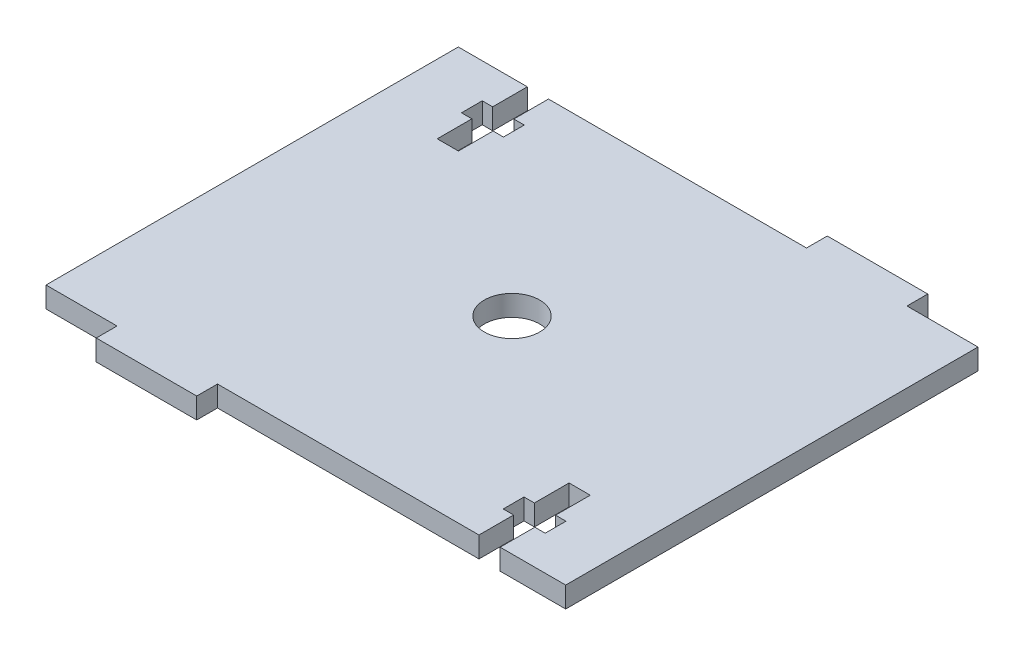
ISO-10303-21;
HEADER;
FILE_DESCRIPTION(('STEP AP214'),'2;1');
FILE_NAME('part.step','',(''),(''),'','','');
FILE_SCHEMA(('AUTOMOTIVE_DESIGN { 1 0 10303 214 1 1 1 1 }'));
ENDSEC;
DATA;
#1=APPLICATION_CONTEXT('core data for automotive mechanical design processes');
#2=APPLICATION_PROTOCOL_DEFINITION('international standard','automotive_design',2000,#1);
#3=PRODUCT_CONTEXT('',#1,'mechanical');
#4=PRODUCT('Part','Part','',(#3));
#5=PRODUCT_RELATED_PRODUCT_CATEGORY('part','',(#4));
#6=PRODUCT_DEFINITION_FORMATION('','',#4);
#7=PRODUCT_DEFINITION_CONTEXT('part definition',#1,'design');
#8=PRODUCT_DEFINITION('design','',#6,#7);
#9=PRODUCT_DEFINITION_SHAPE('','',#8);
#10=(LENGTH_UNIT() NAMED_UNIT(*) SI_UNIT(.MILLI.,.METRE.));
#11=(NAMED_UNIT(*) PLANE_ANGLE_UNIT() SI_UNIT($,.RADIAN.));
#12=(NAMED_UNIT(*) SI_UNIT($,.STERADIAN.) SOLID_ANGLE_UNIT());
#13=UNCERTAINTY_MEASURE_WITH_UNIT(LENGTH_MEASURE(1.E-05),#10,'distance_accuracy_value','');
#14=(GEOMETRIC_REPRESENTATION_CONTEXT(3) GLOBAL_UNCERTAINTY_ASSIGNED_CONTEXT((#13)) GLOBAL_UNIT_ASSIGNED_CONTEXT((#10,
#11,#12)) REPRESENTATION_CONTEXT('',''));
#15=CARTESIAN_POINT('',(0.,0.,0.));
#16=DIRECTION('',(0.,0.,1.));
#17=DIRECTION('',(1.,0.,0.));
#18=AXIS2_PLACEMENT_3D('',#15,#16,#17);
#19=CARTESIAN_POINT('',(24.7500000000028,3.,1.71737624121723E-13));
#20=DIRECTION('',(1.,0.,0.));
#21=DIRECTION('',(0.,0.,-1.));
#22=AXIS2_PLACEMENT_3D('',#19,#20,#21);
#23=PLANE('',#22);
#24=DIRECTION('',(0.,0.,1.));
#25=VECTOR('',#24,1.);
#26=CARTESIAN_POINT('',(24.7500000000028,0.,1.71737624121723E-13));
#27=LINE('',#26,#25);
#28=CARTESIAN_POINT('',(24.7500000000028,0.,0.));
#29=VERTEX_POINT('',#28);
#30=CARTESIAN_POINT('',(24.7500000000028,0.,3.00000000000063));
#31=VERTEX_POINT('',#30);
#32=EDGE_CURVE('E301',#29,#31,#27,.T.);
#33=ORIENTED_EDGE('',*,*,#32,.F.);
#34=DIRECTION('',(0.,-1.,0.));
#35=VECTOR('',#34,1.);
#36=CARTESIAN_POINT('',(24.7500000000028,3.,0.));
#37=LINE('',#36,#35);
#38=CARTESIAN_POINT('',(24.7500000000028,3.,0.));
#39=VERTEX_POINT('',#38);
#40=EDGE_CURVE('E11',#39,#29,#37,.T.);
#41=ORIENTED_EDGE('',*,*,#40,.F.);
#42=DIRECTION('',(0.,0.,1.));
#43=VECTOR('',#42,1.);
#44=CARTESIAN_POINT('',(24.7500000000028,3.,1.71737624121723E-13));
#45=LINE('',#44,#43);
#46=CARTESIAN_POINT('',(24.7500000000028,3.,3.00000000000063));
#47=VERTEX_POINT('',#46);
#48=EDGE_CURVE('E400',#39,#47,#45,.T.);
#49=ORIENTED_EDGE('',*,*,#48,.T.);
#50=DIRECTION('',(0.,-1.,0.));
#51=VECTOR('',#50,1.);
#52=CARTESIAN_POINT('',(24.7500000000028,3.,3.00000000000063));
#53=LINE('',#52,#51);
#54=EDGE_CURVE('E48',#47,#31,#53,.T.);
#55=ORIENTED_EDGE('',*,*,#54,.T.);
#56=EDGE_LOOP('',(#33,#41,#49,#55));
#57=FACE_BOUND('',#56,.T.);
#58=ADVANCED_FACE('F32',(#57),#23,.T.);
#59=CARTESIAN_POINT('',(0.,3.,0.));
#60=DIRECTION('',(0.,0.,-1.));
#61=DIRECTION('',(-1.,0.,0.));
#62=AXIS2_PLACEMENT_3D('',#59,#60,#61);
#63=PLANE('',#62);
#64=DIRECTION('',(1.,0.,0.));
#65=VECTOR('',#64,1.);
#66=CARTESIAN_POINT('',(0.,0.,0.));
#67=LINE('',#66,#65);
#68=CARTESIAN_POINT('',(62.4840512444006,0.,0.));
#69=VERTEX_POINT('',#68);
#70=EDGE_CURVE('E303',#29,#69,#67,.T.);
#71=ORIENTED_EDGE('',*,*,#70,.T.);
#72=DIRECTION('',(0.,-1.,0.));
#73=VECTOR('',#72,1.);
#74=CARTESIAN_POINT('',(62.4840512444006,3.,0.));
#75=LINE('',#74,#73);
#76=CARTESIAN_POINT('',(62.4840512444006,3.,0.));
#77=VERTEX_POINT('',#76);
#78=EDGE_CURVE('E40',#77,#69,#75,.T.);
#79=ORIENTED_EDGE('',*,*,#78,.F.);
#80=DIRECTION('',(1.,0.,0.));
#81=VECTOR('',#80,1.);
#82=CARTESIAN_POINT('',(0.,3.,0.));
#83=LINE('',#82,#81);
#84=EDGE_CURVE('E281',#39,#77,#83,.T.);
#85=ORIENTED_EDGE('',*,*,#84,.F.);
#86=ORIENTED_EDGE('',*,*,#40,.T.);
#87=EDGE_LOOP('',(#71,#79,#85,#86));
#88=FACE_BOUND('',#87,.T.);
#89=ADVANCED_FACE('F474',(#88),#63,.F.);
#90=CARTESIAN_POINT('',(62.4840512444005,3.,4.33570202271198E-13));
#91=DIRECTION('',(1.,0.,0.));
#92=DIRECTION('',(0.,0.,-1.));
#93=AXIS2_PLACEMENT_3D('',#90,#91,#92);
#94=PLANE('',#93);
#95=DIRECTION('',(0.,0.,1.));
#96=VECTOR('',#95,1.);
#97=CARTESIAN_POINT('',(62.4840512444005,0.,4.33570202271198E-13));
#98=LINE('',#97,#96);
#99=CARTESIAN_POINT('',(62.4840512444006,0.,-5.00000000000209));
#100=VERTEX_POINT('',#99);
#101=EDGE_CURVE('E306',#100,#69,#98,.T.);
#102=ORIENTED_EDGE('',*,*,#101,.F.);
#103=DIRECTION('',(0.,-1.,0.));
#104=VECTOR('',#103,1.);
#105=CARTESIAN_POINT('',(62.4840512444006,3.,-5.00000000000209));
#106=LINE('',#105,#104);
#107=CARTESIAN_POINT('',(62.4840512444006,3.,-5.00000000000209));
#108=VERTEX_POINT('',#107);
#109=EDGE_CURVE('E464',#108,#100,#106,.T.);
#110=ORIENTED_EDGE('',*,*,#109,.F.);
#111=DIRECTION('',(0.,0.,1.));
#112=VECTOR('',#111,1.);
#113=CARTESIAN_POINT('',(62.4840512444005,3.,4.33570202271198E-13));
#114=LINE('',#113,#112);
#115=EDGE_CURVE('E471',#108,#77,#114,.T.);
#116=ORIENTED_EDGE('',*,*,#115,.T.);
#117=ORIENTED_EDGE('',*,*,#78,.T.);
#118=EDGE_LOOP('',(#102,#110,#116,#117));
#119=FACE_BOUND('',#118,.T.);
#120=ADVANCED_FACE('F469',(#119),#94,.T.);
#121=CARTESIAN_POINT('',(0.,3.,-5.00000000000237));
#122=DIRECTION('',(0.,0.,-1.));
#123=DIRECTION('',(-1.,0.,0.));
#124=AXIS2_PLACEMENT_3D('',#121,#122,#123);
#125=PLANE('',#124);
#126=DIRECTION('',(1.,0.,0.));
#127=VECTOR('',#126,1.);
#128=CARTESIAN_POINT('',(0.,0.,-5.00000000000237));
#129=LINE('',#128,#127);
#130=CARTESIAN_POINT('',(60.9840512444006,0.,-5.00000000000209));
#131=VERTEX_POINT('',#130);
#132=EDGE_CURVE('E310',#131,#100,#129,.T.);
#133=ORIENTED_EDGE('',*,*,#132,.F.);
#134=DIRECTION('',(0.,-1.,0.));
#135=VECTOR('',#134,1.);
#136=CARTESIAN_POINT('',(60.9840512444006,3.,-5.00000000000209));
#137=LINE('',#136,#135);
#138=CARTESIAN_POINT('',(60.9840512444006,3.,-5.00000000000209));
#139=VERTEX_POINT('',#138);
#140=EDGE_CURVE('E462',#139,#131,#137,.T.);
#141=ORIENTED_EDGE('',*,*,#140,.F.);
#142=DIRECTION('',(1.,0.,0.));
#143=VECTOR('',#142,1.);
#144=CARTESIAN_POINT('',(0.,3.,-5.00000000000237));
#145=LINE('',#144,#143);
#146=EDGE_CURVE('E484',#139,#108,#145,.T.);
#147=ORIENTED_EDGE('',*,*,#146,.T.);
#148=ORIENTED_EDGE('',*,*,#109,.T.);
#149=EDGE_LOOP('',(#133,#141,#147,#148));
#150=FACE_BOUND('',#149,.T.);
#151=ADVANCED_FACE('F481',(#150),#125,.T.);
#152=CARTESIAN_POINT('',(60.9840512444006,3.,2.82107907610224E-13));
#153=DIRECTION('',(1.,0.,0.));
#154=DIRECTION('',(0.,0.,-1.));
#155=AXIS2_PLACEMENT_3D('',#152,#153,#154);
#156=PLANE('',#155);
#157=DIRECTION('',(0.,0.,1.));
#158=VECTOR('',#157,1.);
#159=CARTESIAN_POINT('',(60.9840512444006,0.,2.82107907610224E-13));
#160=LINE('',#159,#158);
#161=CARTESIAN_POINT('',(60.9840512444006,0.,-8.0000000000021));
#162=VERTEX_POINT('',#161);
#163=EDGE_CURVE('E313',#162,#131,#160,.T.);
#164=ORIENTED_EDGE('',*,*,#163,.F.);
#165=DIRECTION('',(0.,-1.,0.));
#166=VECTOR('',#165,1.);
#167=CARTESIAN_POINT('',(60.9840512444006,3.,-8.0000000000021));
#168=LINE('',#167,#166);
#169=CARTESIAN_POINT('',(60.9840512444006,3.,-8.0000000000021));
#170=VERTEX_POINT('',#169);
#171=EDGE_CURVE('E460',#170,#162,#168,.T.);
#172=ORIENTED_EDGE('',*,*,#171,.F.);
#173=DIRECTION('',(0.,0.,1.));
#174=VECTOR('',#173,1.);
#175=CARTESIAN_POINT('',(60.9840512444006,3.,2.82107907610224E-13));
#176=LINE('',#175,#174);
#177=EDGE_CURVE('E488',#170,#139,#176,.T.);
#178=ORIENTED_EDGE('',*,*,#177,.T.);
#179=ORIENTED_EDGE('',*,*,#140,.T.);
#180=EDGE_LOOP('',(#164,#172,#178,#179));
#181=FACE_BOUND('',#180,.T.);
#182=ADVANCED_FACE('F670',(#181),#156,.T.);
#183=CARTESIAN_POINT('',(0.,3.,-8.00000000000267));
#184=DIRECTION('',(0.,0.,1.));
#185=DIRECTION('',(1.,0.,0.));
#186=AXIS2_PLACEMENT_3D('',#183,#184,#185);
#187=PLANE('',#186);
#188=DIRECTION('',(-1.,0.,0.));
#189=VECTOR('',#188,1.);
#190=CARTESIAN_POINT('',(0.,0.,-8.00000000000267));
#191=LINE('',#190,#189);
#192=CARTESIAN_POINT('',(62.4840512444006,0.,-8.00000000000209));
#193=VERTEX_POINT('',#192);
#194=EDGE_CURVE('E316',#193,#162,#191,.T.);
#195=ORIENTED_EDGE('',*,*,#194,.F.);
#196=DIRECTION('',(0.,-1.,0.));
#197=VECTOR('',#196,1.);
#198=CARTESIAN_POINT('',(62.4840512444006,3.,-8.00000000000209));
#199=LINE('',#198,#197);
#200=CARTESIAN_POINT('',(62.4840512444006,3.,-8.00000000000209));
#201=VERTEX_POINT('',#200);
#202=EDGE_CURVE('E458',#201,#193,#199,.T.);
#203=ORIENTED_EDGE('',*,*,#202,.F.);
#204=DIRECTION('',(-1.,0.,0.));
#205=VECTOR('',#204,1.);
#206=CARTESIAN_POINT('',(0.,3.,-8.00000000000267));
#207=LINE('',#206,#205);
#208=EDGE_CURVE('E493',#201,#170,#207,.T.);
#209=ORIENTED_EDGE('',*,*,#208,.T.);
#210=ORIENTED_EDGE('',*,*,#171,.T.);
#211=EDGE_LOOP('',(#195,#203,#209,#210));
#212=FACE_BOUND('',#211,.T.);
#213=ADVANCED_FACE('F668',(#212),#187,.T.);
#214=CARTESIAN_POINT('',(62.4840512444005,3.,4.33570202271198E-13));
#215=DIRECTION('',(1.,0.,0.));
#216=DIRECTION('',(0.,0.,-1.));
#217=AXIS2_PLACEMENT_3D('',#214,#215,#216);
#218=PLANE('',#217);
#219=DIRECTION('',(0.,0.,1.));
#220=VECTOR('',#219,1.);
#221=CARTESIAN_POINT('',(62.4840512444005,0.,4.33570202271198E-13));
#222=LINE('',#221,#220);
#223=CARTESIAN_POINT('',(62.4840512444006,0.,-13.0000000000021));
#224=VERTEX_POINT('',#223);
#225=EDGE_CURVE('E319',#224,#193,#222,.T.);
#226=ORIENTED_EDGE('',*,*,#225,.F.);
#227=DIRECTION('',(0.,-1.,0.));
#228=VECTOR('',#227,1.);
#229=CARTESIAN_POINT('',(62.4840512444006,3.,-13.0000000000021));
#230=LINE('',#229,#228);
#231=CARTESIAN_POINT('',(62.4840512444006,3.,-13.0000000000021));
#232=VERTEX_POINT('',#231);
#233=EDGE_CURVE('E456',#232,#224,#230,.T.);
#234=ORIENTED_EDGE('',*,*,#233,.F.);
#235=DIRECTION('',(0.,0.,1.));
#236=VECTOR('',#235,1.);
#237=CARTESIAN_POINT('',(62.4840512444005,3.,4.33570202271198E-13));
#238=LINE('',#237,#236);
#239=EDGE_CURVE('E496',#232,#201,#238,.T.);
#240=ORIENTED_EDGE('',*,*,#239,.T.);
#241=ORIENTED_EDGE('',*,*,#202,.T.);
#242=EDGE_LOOP('',(#226,#234,#240,#241));
#243=FACE_BOUND('',#242,.T.);
#244=ADVANCED_FACE('F664',(#243),#218,.T.);
#245=CARTESIAN_POINT('',(9.38196026013298E-12,3.,-13.0000000000472));
#246=DIRECTION('',(-7.21689250776841E-13,0.,1.));
#247=DIRECTION('',(1.,0.,7.21689250776841E-13));
#248=AXIS2_PLACEMENT_3D('',#245,#246,#247);
#249=PLANE('',#248);
#250=DIRECTION('',(-1.,0.,-7.21689250776841E-13));
#251=VECTOR('',#250,1.);
#252=CARTESIAN_POINT('',(9.38196026013298E-12,0.,-13.0000000000472));
#253=LINE('',#252,#251);
#254=CARTESIAN_POINT('',(65.5415559239664,0.,-12.9999999999999));
#255=VERTEX_POINT('',#254);
#256=EDGE_CURVE('E322',#255,#224,#253,.T.);
#257=ORIENTED_EDGE('',*,*,#256,.F.);
#258=DIRECTION('',(0.,-1.,0.));
#259=VECTOR('',#258,1.);
#260=CARTESIAN_POINT('',(65.5415559239664,3.,-12.9999999999999));
#261=LINE('',#260,#259);
#262=CARTESIAN_POINT('',(65.5415559239664,3.,-12.9999999999999));
#263=VERTEX_POINT('',#262);
#264=EDGE_CURVE('E454',#263,#255,#261,.T.);
#265=ORIENTED_EDGE('',*,*,#264,.F.);
#266=DIRECTION('',(-1.,0.,-7.21689250776841E-13));
#267=VECTOR('',#266,1.);
#268=CARTESIAN_POINT('',(9.38196026013298E-12,3.,-13.0000000000472));
#269=LINE('',#268,#267);
#270=EDGE_CURVE('E499',#263,#232,#269,.T.);
#271=ORIENTED_EDGE('',*,*,#270,.T.);
#272=ORIENTED_EDGE('',*,*,#233,.T.);
#273=EDGE_LOOP('',(#257,#265,#271,#272));
#274=FACE_BOUND('',#273,.T.);
#275=ADVANCED_FACE('F660',(#274),#249,.T.);
#276=CARTESIAN_POINT('',(65.5415559239651,3.,6.36700263995033E-12));
#277=DIRECTION('',(-1.,0.,0.));
#278=DIRECTION('',(0.,0.,1.));
#279=AXIS2_PLACEMENT_3D('',#276,#277,#278);
#280=PLANE('',#279);
#281=DIRECTION('',(0.,0.,-1.));
#282=VECTOR('',#281,1.);
#283=CARTESIAN_POINT('',(65.5415559239651,0.,6.36700263995033E-12));
#284=LINE('',#283,#282);
#285=CARTESIAN_POINT('',(65.5415559239659,0.,-8.00000000000207));
#286=VERTEX_POINT('',#285);
#287=EDGE_CURVE('E325',#286,#255,#284,.T.);
#288=ORIENTED_EDGE('',*,*,#287,.F.);
#289=DIRECTION('',(0.,-1.,0.));
#290=VECTOR('',#289,1.);
#291=CARTESIAN_POINT('',(65.5415559239659,3.,-8.00000000000207));
#292=LINE('',#291,#290);
#293=CARTESIAN_POINT('',(65.5415559239659,3.,-8.00000000000207));
#294=VERTEX_POINT('',#293);
#295=EDGE_CURVE('E452',#294,#286,#292,.T.);
#296=ORIENTED_EDGE('',*,*,#295,.F.);
#297=DIRECTION('',(0.,0.,-1.));
#298=VECTOR('',#297,1.);
#299=CARTESIAN_POINT('',(65.5415559239651,3.,6.36700263995033E-12));
#300=LINE('',#299,#298);
#301=EDGE_CURVE('E502',#294,#263,#300,.T.);
#302=ORIENTED_EDGE('',*,*,#301,.T.);
#303=ORIENTED_EDGE('',*,*,#264,.T.);
#304=EDGE_LOOP('',(#288,#296,#302,#303));
#305=FACE_BOUND('',#304,.T.);
#306=ADVANCED_FACE('F656',(#305),#280,.T.);
#307=CARTESIAN_POINT('',(1.19904086660998E-11,3.,-8.0000000001003));
#308=DIRECTION('',(-1.49880108324368E-12,0.,1.));
#309=DIRECTION('',(1.,0.,1.49880108324368E-12));
#310=AXIS2_PLACEMENT_3D('',#307,#308,#309);
#311=PLANE('',#310);
#312=DIRECTION('',(-1.,0.,-1.49880108324368E-12));
#313=VECTOR('',#312,1.);
#314=CARTESIAN_POINT('',(1.19904086660998E-11,0.,-8.0000000001003));
#315=LINE('',#314,#313);
#316=CARTESIAN_POINT('',(67.0415559239662,0.,-7.99999999999982));
#317=VERTEX_POINT('',#316);
#318=EDGE_CURVE('E328',#317,#286,#315,.T.);
#319=ORIENTED_EDGE('',*,*,#318,.F.);
#320=DIRECTION('',(0.,-1.,0.));
#321=VECTOR('',#320,1.);
#322=CARTESIAN_POINT('',(67.0415559239662,3.,-7.99999999999982));
#323=LINE('',#322,#321);
#324=CARTESIAN_POINT('',(67.0415559239662,3.,-7.99999999999982));
#325=VERTEX_POINT('',#324);
#326=EDGE_CURVE('E450',#325,#317,#323,.T.);
#327=ORIENTED_EDGE('',*,*,#326,.F.);
#328=DIRECTION('',(-1.,0.,-1.49880108324368E-12));
#329=VECTOR('',#328,1.);
#330=CARTESIAN_POINT('',(1.19904086660998E-11,3.,-8.0000000001003));
#331=LINE('',#330,#329);
#332=EDGE_CURVE('E505',#325,#294,#331,.T.);
#333=ORIENTED_EDGE('',*,*,#332,.T.);
#334=ORIENTED_EDGE('',*,*,#295,.T.);
#335=EDGE_LOOP('',(#319,#327,#333,#334));
#336=FACE_BOUND('',#335,.T.);
#337=ADVANCED_FACE('F652',(#336),#311,.T.);
#338=CARTESIAN_POINT('',(67.0415559239658,3.,2.79116546225557E-12));
#339=DIRECTION('',(-1.,0.,0.));
#340=DIRECTION('',(0.,0.,1.));
#341=AXIS2_PLACEMENT_3D('',#338,#339,#340);
#342=PLANE('',#341);
#343=DIRECTION('',(0.,0.,-1.));
#344=VECTOR('',#343,1.);
#345=CARTESIAN_POINT('',(67.0415559239658,0.,2.79116546225557E-12));
#346=LINE('',#345,#344);
#347=CARTESIAN_POINT('',(67.0415559239661,0.,-4.99999999999982));
#348=VERTEX_POINT('',#347);
#349=EDGE_CURVE('E331',#348,#317,#346,.T.);
#350=ORIENTED_EDGE('',*,*,#349,.F.);
#351=DIRECTION('',(0.,-1.,0.));
#352=VECTOR('',#351,1.);
#353=CARTESIAN_POINT('',(67.0415559239661,3.,-4.99999999999982));
#354=LINE('',#353,#352);
#355=CARTESIAN_POINT('',(67.0415559239661,3.,-4.99999999999982));
#356=VERTEX_POINT('',#355);
#357=EDGE_CURVE('E448',#356,#348,#354,.T.);
#358=ORIENTED_EDGE('',*,*,#357,.F.);
#359=DIRECTION('',(0.,0.,-1.));
#360=VECTOR('',#359,1.);
#361=CARTESIAN_POINT('',(67.0415559239658,3.,2.79116546225557E-12));
#362=LINE('',#361,#360);
#363=EDGE_CURVE('E508',#356,#325,#362,.T.);
#364=ORIENTED_EDGE('',*,*,#363,.T.);
#365=ORIENTED_EDGE('',*,*,#326,.T.);
#366=EDGE_LOOP('',(#350,#358,#364,#365));
#367=FACE_BOUND('',#366,.T.);
#368=ADVANCED_FACE('F648',(#367),#342,.T.);
#369=CARTESIAN_POINT('',(7.4940054163693E-12,3.,-5.0000000001003));
#370=DIRECTION('',(1.49880108324379E-12,0.,-1.));
#371=DIRECTION('',(-1.,0.,-1.49880108324379E-12));
#372=AXIS2_PLACEMENT_3D('',#369,#370,#371);
#373=PLANE('',#372);
#374=DIRECTION('',(1.,0.,1.49880108324379E-12));
#375=VECTOR('',#374,1.);
#376=CARTESIAN_POINT('',(7.4940054163693E-12,0.,-5.0000000001003));
#377=LINE('',#376,#375);
#378=CARTESIAN_POINT('',(65.5415559239659,0.,-5.00000000000207));
#379=VERTEX_POINT('',#378);
#380=EDGE_CURVE('E334',#379,#348,#377,.T.);
#381=ORIENTED_EDGE('',*,*,#380,.F.);
#382=DIRECTION('',(0.,-1.,0.));
#383=VECTOR('',#382,1.);
#384=CARTESIAN_POINT('',(65.5415559239659,3.,-5.00000000000207));
#385=LINE('',#384,#383);
#386=CARTESIAN_POINT('',(65.5415559239659,3.,-5.00000000000207));
#387=VERTEX_POINT('',#386);
#388=EDGE_CURVE('E446',#387,#379,#385,.T.);
#389=ORIENTED_EDGE('',*,*,#388,.F.);
#390=DIRECTION('',(1.,0.,1.49880108324379E-12));
#391=VECTOR('',#390,1.);
#392=CARTESIAN_POINT('',(7.4940054163693E-12,3.,-5.0000000001003));
#393=LINE('',#392,#391);
#394=EDGE_CURVE('E511',#387,#356,#393,.T.);
#395=ORIENTED_EDGE('',*,*,#394,.T.);
#396=ORIENTED_EDGE('',*,*,#357,.T.);
#397=EDGE_LOOP('',(#381,#389,#395,#396));
#398=FACE_BOUND('',#397,.T.);
#399=ADVANCED_FACE('F645',(#398),#373,.T.);
#400=CARTESIAN_POINT('',(65.5415559239659,3.,0.));
#401=DIRECTION('',(1.,0.,0.));
#402=DIRECTION('',(0.,0.,-1.));
#403=AXIS2_PLACEMENT_3D('',#400,#401,#402);
#404=PLANE('',#403);
#405=DIRECTION('',(0.,0.,1.));
#406=VECTOR('',#405,1.);
#407=CARTESIAN_POINT('',(65.5415559239659,0.,0.));
#408=LINE('',#407,#406);
#409=CARTESIAN_POINT('',(65.5415559239659,0.,0.));
#410=VERTEX_POINT('',#409);
#411=EDGE_CURVE('E337',#379,#410,#408,.T.);
#412=ORIENTED_EDGE('',*,*,#411,.T.);
#413=DIRECTION('',(0.,-1.,0.));
#414=VECTOR('',#413,1.);
#415=CARTESIAN_POINT('',(65.5415559239659,3.,0.));
#416=LINE('',#415,#414);
#417=CARTESIAN_POINT('',(65.5415559239659,3.,0.));
#418=VERTEX_POINT('',#417);
#419=EDGE_CURVE('E443',#418,#410,#416,.T.);
#420=ORIENTED_EDGE('',*,*,#419,.F.);
#421=DIRECTION('',(0.,0.,1.));
#422=VECTOR('',#421,1.);
#423=CARTESIAN_POINT('',(65.5415559239659,3.,0.));
#424=LINE('',#423,#422);
#425=EDGE_CURVE('E514',#387,#418,#424,.T.);
#426=ORIENTED_EDGE('',*,*,#425,.F.);
#427=ORIENTED_EDGE('',*,*,#388,.T.);
#428=EDGE_LOOP('',(#412,#420,#426,#427));
#429=FACE_BOUND('',#428,.T.);
#430=ADVANCED_FACE('F642',(#429),#404,.F.);
#431=CARTESIAN_POINT('',(75.,0.,0.));
#432=VERTEX_POINT('',#431);
#433=EDGE_CURVE('E307',#410,#432,#67,.T.);
#434=ORIENTED_EDGE('',*,*,#433,.T.);
#435=DIRECTION('',(0.,-1.,0.));
#436=VECTOR('',#435,1.);
#437=CARTESIAN_POINT('',(75.,3.,0.));
#438=LINE('',#437,#436);
#439=CARTESIAN_POINT('',(75.,3.,0.));
#440=VERTEX_POINT('',#439);
#441=EDGE_CURVE('E440',#440,#432,#438,.T.);
#442=ORIENTED_EDGE('',*,*,#441,.F.);
#443=EDGE_CURVE('E280',#418,#440,#83,.T.);
#444=ORIENTED_EDGE('',*,*,#443,.F.);
#445=ORIENTED_EDGE('',*,*,#419,.T.);
#446=EDGE_LOOP('',(#434,#442,#444,#445));
#447=FACE_BOUND('',#446,.T.);
#448=ADVANCED_FACE('F622',(#447),#63,.F.);
#449=CARTESIAN_POINT('',(75.,3.,0.));
#450=DIRECTION('',(-1.,0.,0.));
#451=DIRECTION('',(0.,0.,1.));
#452=AXIS2_PLACEMENT_3D('',#449,#450,#451);
#453=PLANE('',#452);
#454=DIRECTION('',(0.,0.,-1.));
#455=VECTOR('',#454,1.);
#456=CARTESIAN_POINT('',(75.,0.,0.));
#457=LINE('',#456,#455);
#458=CARTESIAN_POINT('',(75.,0.,-59.5));
#459=VERTEX_POINT('',#458);
#460=EDGE_CURVE('E339',#432,#459,#457,.T.);
#461=ORIENTED_EDGE('',*,*,#460,.T.);
#462=DIRECTION('',(0.,-1.,0.));
#463=VECTOR('',#462,1.);
#464=CARTESIAN_POINT('',(75.,3.,-59.5));
#465=LINE('',#464,#463);
#466=CARTESIAN_POINT('',(75.,3.,-59.5));
#467=VERTEX_POINT('',#466);
#468=EDGE_CURVE('E438',#467,#459,#465,.T.);
#469=ORIENTED_EDGE('',*,*,#468,.F.);
#470=DIRECTION('',(0.,0.,-1.));
#471=VECTOR('',#470,1.);
#472=CARTESIAN_POINT('',(75.,3.,0.));
#473=LINE('',#472,#471);
#474=EDGE_CURVE('E516',#440,#467,#473,.T.);
#475=ORIENTED_EDGE('',*,*,#474,.F.);
#476=ORIENTED_EDGE('',*,*,#441,.T.);
#477=EDGE_LOOP('',(#461,#469,#475,#476));
#478=FACE_BOUND('',#477,.T.);
#479=ADVANCED_FACE('F629',(#478),#453,.F.);
#480=CARTESIAN_POINT('',(0.,3.,-59.5));
#481=DIRECTION('',(0.,0.,-1.));
#482=DIRECTION('',(-1.,0.,0.));
#483=AXIS2_PLACEMENT_3D('',#480,#481,#482);
#484=PLANE('',#483);
#485=DIRECTION('',(1.,0.,0.));
#486=VECTOR('',#485,1.);
#487=CARTESIAN_POINT('',(0.,0.,-59.5));
#488=LINE('',#487,#486);
#489=CARTESIAN_POINT('',(64.75,0.,-59.5));
#490=VERTEX_POINT('',#489);
#491=EDGE_CURVE('E342',#490,#459,#488,.T.);
#492=ORIENTED_EDGE('',*,*,#491,.F.);
#493=DIRECTION('',(0.,-1.,0.));
#494=VECTOR('',#493,1.);
#495=CARTESIAN_POINT('',(64.75,3.,-59.5));
#496=LINE('',#495,#494);
#497=CARTESIAN_POINT('',(64.75,3.,-59.5));
#498=VERTEX_POINT('',#497);
#499=EDGE_CURVE('E436',#498,#490,#496,.T.);
#500=ORIENTED_EDGE('',*,*,#499,.F.);
#501=DIRECTION('',(1.,0.,0.));
#502=VECTOR('',#501,1.);
#503=CARTESIAN_POINT('',(0.,3.,-59.5));
#504=LINE('',#503,#502);
#505=EDGE_CURVE('E518',#498,#467,#504,.T.);
#506=ORIENTED_EDGE('',*,*,#505,.T.);
#507=ORIENTED_EDGE('',*,*,#468,.T.);
#508=EDGE_LOOP('',(#492,#500,#506,#507));
#509=FACE_BOUND('',#508,.T.);
#510=ADVANCED_FACE('F634',(#509),#484,.T.);
#511=CARTESIAN_POINT('',(64.75,3.,0.));
#512=DIRECTION('',(-1.,0.,0.));
#513=DIRECTION('',(0.,0.,1.));
#514=AXIS2_PLACEMENT_3D('',#511,#512,#513);
#515=PLANE('',#514);
#516=DIRECTION('',(0.,0.,-1.));
#517=VECTOR('',#516,1.);
#518=CARTESIAN_POINT('',(64.75,0.,0.));
#519=LINE('',#518,#517);
#520=CARTESIAN_POINT('',(64.75,0.,-62.5));
#521=VERTEX_POINT('',#520);
#522=EDGE_CURVE('E345',#490,#521,#519,.T.);
#523=ORIENTED_EDGE('',*,*,#522,.T.);
#524=DIRECTION('',(0.,-1.,0.));
#525=VECTOR('',#524,1.);
#526=CARTESIAN_POINT('',(64.75,3.,-62.5));
#527=LINE('',#526,#525);
#528=CARTESIAN_POINT('',(64.75,3.,-62.5));
#529=VERTEX_POINT('',#528);
#530=EDGE_CURVE('E434',#529,#521,#527,.T.);
#531=ORIENTED_EDGE('',*,*,#530,.F.);
#532=DIRECTION('',(0.,0.,-1.));
#533=VECTOR('',#532,1.);
#534=CARTESIAN_POINT('',(64.75,3.,0.));
#535=LINE('',#534,#533);
#536=EDGE_CURVE('E521',#498,#529,#535,.T.);
#537=ORIENTED_EDGE('',*,*,#536,.F.);
#538=ORIENTED_EDGE('',*,*,#499,.T.);
#539=EDGE_LOOP('',(#523,#531,#537,#538));
#540=FACE_BOUND('',#539,.T.);
#541=ADVANCED_FACE('F733',(#540),#515,.F.);
#542=CARTESIAN_POINT('',(0.,3.,-62.5));
#543=DIRECTION('',(0.,0.,-1.));
#544=DIRECTION('',(-1.,0.,0.));
#545=AXIS2_PLACEMENT_3D('',#542,#543,#544);
#546=PLANE('',#545);
#547=DIRECTION('',(1.,0.,0.));
#548=VECTOR('',#547,1.);
#549=CARTESIAN_POINT('',(0.,0.,-62.5));
#550=LINE('',#549,#548);
#551=CARTESIAN_POINT('',(50.25,0.,-62.5));
#552=VERTEX_POINT('',#551);
#553=EDGE_CURVE('E350',#552,#521,#550,.T.);
#554=ORIENTED_EDGE('',*,*,#553,.F.);
#555=DIRECTION('',(0.,-1.,0.));
#556=VECTOR('',#555,1.);
#557=CARTESIAN_POINT('',(50.25,3.,-62.5));
#558=LINE('',#557,#556);
#559=CARTESIAN_POINT('',(50.25,3.,-62.5));
#560=VERTEX_POINT('',#559);
#561=EDGE_CURVE('E432',#560,#552,#558,.T.);
#562=ORIENTED_EDGE('',*,*,#561,.F.);
#563=DIRECTION('',(1.,0.,0.));
#564=VECTOR('',#563,1.);
#565=CARTESIAN_POINT('',(0.,3.,-62.5));
#566=LINE('',#565,#564);
#567=EDGE_CURVE('E525',#560,#529,#566,.T.);
#568=ORIENTED_EDGE('',*,*,#567,.T.);
#569=ORIENTED_EDGE('',*,*,#530,.T.);
#570=EDGE_LOOP('',(#554,#562,#568,#569));
#571=FACE_BOUND('',#570,.T.);
#572=ADVANCED_FACE('F729',(#571),#546,.T.);
#573=CARTESIAN_POINT('',(50.25,3.,0.));
#574=DIRECTION('',(-1.,0.,0.));
#575=DIRECTION('',(0.,0.,1.));
#576=AXIS2_PLACEMENT_3D('',#573,#574,#575);
#577=PLANE('',#576);
#578=DIRECTION('',(0.,0.,-1.));
#579=VECTOR('',#578,1.);
#580=CARTESIAN_POINT('',(50.25,0.,0.));
#581=LINE('',#580,#579);
#582=CARTESIAN_POINT('',(50.25,0.,-59.5));
#583=VERTEX_POINT('',#582);
#584=EDGE_CURVE('E353',#583,#552,#581,.T.);
#585=ORIENTED_EDGE('',*,*,#584,.F.);
#586=DIRECTION('',(0.,-1.,0.));
#587=VECTOR('',#586,1.);
#588=CARTESIAN_POINT('',(50.25,3.,-59.5));
#589=LINE('',#588,#587);
#590=CARTESIAN_POINT('',(50.25,3.,-59.5));
#591=VERTEX_POINT('',#590);
#592=EDGE_CURVE('E430',#591,#583,#589,.T.);
#593=ORIENTED_EDGE('',*,*,#592,.F.);
#594=DIRECTION('',(0.,0.,-1.));
#595=VECTOR('',#594,1.);
#596=CARTESIAN_POINT('',(50.25,3.,0.));
#597=LINE('',#596,#595);
#598=EDGE_CURVE('E528',#591,#560,#597,.T.);
#599=ORIENTED_EDGE('',*,*,#598,.T.);
#600=ORIENTED_EDGE('',*,*,#561,.T.);
#601=EDGE_LOOP('',(#585,#593,#599,#600));
#602=FACE_BOUND('',#601,.T.);
#603=ADVANCED_FACE('F726',(#602),#577,.T.);
#604=CARTESIAN_POINT('',(13.0159487556012,0.,-59.5));
#605=VERTEX_POINT('',#604);
#606=EDGE_CURVE('E347',#605,#583,#488,.T.);
#607=ORIENTED_EDGE('',*,*,#606,.F.);
#608=DIRECTION('',(0.,-1.,0.));
#609=VECTOR('',#608,1.);
#610=CARTESIAN_POINT('',(13.0159487556012,3.,-59.5));
#611=LINE('',#610,#609);
#612=CARTESIAN_POINT('',(13.0159487556012,3.,-59.5));
#613=VERTEX_POINT('',#612);
#614=EDGE_CURVE('E428',#613,#605,#611,.T.);
#615=ORIENTED_EDGE('',*,*,#614,.F.);
#616=EDGE_CURVE('E523',#613,#591,#504,.T.);
#617=ORIENTED_EDGE('',*,*,#616,.T.);
#618=ORIENTED_EDGE('',*,*,#592,.T.);
#619=EDGE_LOOP('',(#607,#615,#617,#618));
#620=FACE_BOUND('',#619,.T.);
#621=ADVANCED_FACE('F570',(#620),#484,.T.);
#622=CARTESIAN_POINT('',(13.0159487556012,3.,0.));
#623=DIRECTION('',(-1.,0.,0.));
#624=DIRECTION('',(0.,0.,1.));
#625=AXIS2_PLACEMENT_3D('',#622,#623,#624);
#626=PLANE('',#625);
#627=DIRECTION('',(0.,0.,-1.));
#628=VECTOR('',#627,1.);
#629=CARTESIAN_POINT('',(13.0159487556012,0.,0.));
#630=LINE('',#629,#628);
#631=CARTESIAN_POINT('',(13.0159487556012,0.,-54.5));
#632=VERTEX_POINT('',#631);
#633=EDGE_CURVE('E356',#632,#605,#630,.T.);
#634=ORIENTED_EDGE('',*,*,#633,.F.);
#635=DIRECTION('',(0.,-1.,0.));
#636=VECTOR('',#635,1.);
#637=CARTESIAN_POINT('',(13.0159487556012,3.,-54.5));
#638=LINE('',#637,#636);
#639=CARTESIAN_POINT('',(13.0159487556012,3.,-54.5));
#640=VERTEX_POINT('',#639);
#641=EDGE_CURVE('E426',#640,#632,#638,.T.);
#642=ORIENTED_EDGE('',*,*,#641,.F.);
#643=DIRECTION('',(0.,0.,-1.));
#644=VECTOR('',#643,1.);
#645=CARTESIAN_POINT('',(13.0159487556012,3.,0.));
#646=LINE('',#645,#644);
#647=EDGE_CURVE('E531',#640,#613,#646,.T.);
#648=ORIENTED_EDGE('',*,*,#647,.T.);
#649=ORIENTED_EDGE('',*,*,#614,.T.);
#650=EDGE_LOOP('',(#634,#642,#648,#649));
#651=FACE_BOUND('',#650,.T.);
#652=ADVANCED_FACE('F578',(#651),#626,.T.);
#653=CARTESIAN_POINT('',(-2.52113145175296E-13,3.,-54.4999999999999));
#654=DIRECTION('',(0.,0.,1.));
#655=DIRECTION('',(1.,0.,0.));
#656=AXIS2_PLACEMENT_3D('',#653,#654,#655);
#657=PLANE('',#656);
#658=DIRECTION('',(-1.,0.,0.));
#659=VECTOR('',#658,1.);
#660=CARTESIAN_POINT('',(-2.52113145175296E-13,0.,-54.4999999999999));
#661=LINE('',#660,#659);
#662=CARTESIAN_POINT('',(14.5159487556012,0.,-54.5));
#663=VERTEX_POINT('',#662);
#664=EDGE_CURVE('E359',#663,#632,#661,.T.);
#665=ORIENTED_EDGE('',*,*,#664,.F.);
#666=DIRECTION('',(0.,-1.,0.));
#667=VECTOR('',#666,1.);
#668=CARTESIAN_POINT('',(14.5159487556012,3.,-54.5));
#669=LINE('',#668,#667);
#670=CARTESIAN_POINT('',(14.5159487556012,3.,-54.5));
#671=VERTEX_POINT('',#670);
#672=EDGE_CURVE('E424',#671,#663,#669,.T.);
#673=ORIENTED_EDGE('',*,*,#672,.F.);
#674=DIRECTION('',(-1.,0.,0.));
#675=VECTOR('',#674,1.);
#676=CARTESIAN_POINT('',(-2.52113145175296E-13,3.,-54.4999999999999));
#677=LINE('',#676,#675);
#678=EDGE_CURVE('E534',#671,#640,#677,.T.);
#679=ORIENTED_EDGE('',*,*,#678,.T.);
#680=ORIENTED_EDGE('',*,*,#641,.T.);
#681=EDGE_LOOP('',(#665,#673,#679,#680));
#682=FACE_BOUND('',#681,.T.);
#683=ADVANCED_FACE('F581',(#682),#657,.T.);
#684=CARTESIAN_POINT('',(14.5159487556012,3.,0.));
#685=DIRECTION('',(-1.,0.,0.));
#686=DIRECTION('',(0.,0.,1.));
#687=AXIS2_PLACEMENT_3D('',#684,#685,#686);
#688=PLANE('',#687);
#689=DIRECTION('',(0.,0.,-1.));
#690=VECTOR('',#689,1.);
#691=CARTESIAN_POINT('',(14.5159487556012,0.,0.));
#692=LINE('',#691,#690);
#693=CARTESIAN_POINT('',(14.5159487556012,0.,-51.5));
#694=VERTEX_POINT('',#693);
#695=EDGE_CURVE('E362',#694,#663,#692,.T.);
#696=ORIENTED_EDGE('',*,*,#695,.F.);
#697=DIRECTION('',(0.,-1.,0.));
#698=VECTOR('',#697,1.);
#699=CARTESIAN_POINT('',(14.5159487556012,3.,-51.5));
#700=LINE('',#699,#698);
#701=CARTESIAN_POINT('',(14.5159487556012,3.,-51.5));
#702=VERTEX_POINT('',#701);
#703=EDGE_CURVE('E422',#702,#694,#700,.T.);
#704=ORIENTED_EDGE('',*,*,#703,.F.);
#705=DIRECTION('',(0.,0.,-1.));
#706=VECTOR('',#705,1.);
#707=CARTESIAN_POINT('',(14.5159487556012,3.,0.));
#708=LINE('',#707,#706);
#709=EDGE_CURVE('E537',#702,#671,#708,.T.);
#710=ORIENTED_EDGE('',*,*,#709,.T.);
#711=ORIENTED_EDGE('',*,*,#672,.T.);
#712=EDGE_LOOP('',(#696,#704,#710,#711));
#713=FACE_BOUND('',#712,.T.);
#714=ADVANCED_FACE('F586',(#713),#688,.T.);
#715=CARTESIAN_POINT('',(0.,3.,-51.5));
#716=DIRECTION('',(0.,0.,-1.));
#717=DIRECTION('',(-1.,0.,0.));
#718=AXIS2_PLACEMENT_3D('',#715,#716,#717);
#719=PLANE('',#718);
#720=DIRECTION('',(1.,0.,0.));
#721=VECTOR('',#720,1.);
#722=CARTESIAN_POINT('',(0.,0.,-51.5));
#723=LINE('',#722,#721);
#724=CARTESIAN_POINT('',(13.0159487556012,0.,-51.5));
#725=VERTEX_POINT('',#724);
#726=EDGE_CURVE('E365',#725,#694,#723,.T.);
#727=ORIENTED_EDGE('',*,*,#726,.F.);
#728=DIRECTION('',(0.,-1.,0.));
#729=VECTOR('',#728,1.);
#730=CARTESIAN_POINT('',(13.0159487556012,3.,-51.5));
#731=LINE('',#730,#729);
#732=CARTESIAN_POINT('',(13.0159487556012,3.,-51.5));
#733=VERTEX_POINT('',#732);
#734=EDGE_CURVE('E420',#733,#725,#731,.T.);
#735=ORIENTED_EDGE('',*,*,#734,.F.);
#736=DIRECTION('',(1.,0.,0.));
#737=VECTOR('',#736,1.);
#738=CARTESIAN_POINT('',(0.,3.,-51.5));
#739=LINE('',#738,#737);
#740=EDGE_CURVE('E540',#733,#702,#739,.T.);
#741=ORIENTED_EDGE('',*,*,#740,.T.);
#742=ORIENTED_EDGE('',*,*,#703,.T.);
#743=EDGE_LOOP('',(#727,#735,#741,#742));
#744=FACE_BOUND('',#743,.T.);
#745=ADVANCED_FACE('F589',(#744),#719,.T.);
#746=CARTESIAN_POINT('',(13.0159487556012,3.,0.));
#747=DIRECTION('',(-1.,0.,0.));
#748=DIRECTION('',(0.,0.,1.));
#749=AXIS2_PLACEMENT_3D('',#746,#747,#748);
#750=PLANE('',#749);
#751=DIRECTION('',(0.,0.,-1.));
#752=VECTOR('',#751,1.);
#753=CARTESIAN_POINT('',(13.0159487556012,0.,0.));
#754=LINE('',#753,#752);
#755=CARTESIAN_POINT('',(13.0159487556012,0.,-46.5));
#756=VERTEX_POINT('',#755);
#757=EDGE_CURVE('E368',#756,#725,#754,.T.);
#758=ORIENTED_EDGE('',*,*,#757,.F.);
#759=DIRECTION('',(0.,-1.,0.));
#760=VECTOR('',#759,1.);
#761=CARTESIAN_POINT('',(13.0159487556012,3.,-46.5));
#762=LINE('',#761,#760);
#763=CARTESIAN_POINT('',(13.0159487556012,3.,-46.5));
#764=VERTEX_POINT('',#763);
#765=EDGE_CURVE('E418',#764,#756,#762,.T.);
#766=ORIENTED_EDGE('',*,*,#765,.F.);
#767=DIRECTION('',(0.,0.,-1.));
#768=VECTOR('',#767,1.);
#769=CARTESIAN_POINT('',(13.0159487556012,3.,0.));
#770=LINE('',#769,#768);
#771=EDGE_CURVE('E543',#764,#733,#770,.T.);
#772=ORIENTED_EDGE('',*,*,#771,.T.);
#773=ORIENTED_EDGE('',*,*,#734,.T.);
#774=EDGE_LOOP('',(#758,#766,#772,#773));
#775=FACE_BOUND('',#774,.T.);
#776=ADVANCED_FACE('F594',(#775),#750,.T.);
#777=CARTESIAN_POINT('',(0.,3.,-46.5));
#778=DIRECTION('',(0.,0.,-1.));
#779=DIRECTION('',(-1.,0.,0.));
#780=AXIS2_PLACEMENT_3D('',#777,#778,#779);
#781=PLANE('',#780);
#782=DIRECTION('',(1.,0.,0.));
#783=VECTOR('',#782,1.);
#784=CARTESIAN_POINT('',(0.,0.,-46.5));
#785=LINE('',#784,#783);
#786=CARTESIAN_POINT('',(9.95844407603588,0.,-46.5));
#787=VERTEX_POINT('',#786);
#788=EDGE_CURVE('E371',#787,#756,#785,.T.);
#789=ORIENTED_EDGE('',*,*,#788,.F.);
#790=DIRECTION('',(0.,-1.,0.));
#791=VECTOR('',#790,1.);
#792=CARTESIAN_POINT('',(9.95844407603588,3.,-46.5));
#793=LINE('',#792,#791);
#794=CARTESIAN_POINT('',(9.95844407603588,3.,-46.5));
#795=VERTEX_POINT('',#794);
#796=EDGE_CURVE('E416',#795,#787,#793,.T.);
#797=ORIENTED_EDGE('',*,*,#796,.F.);
#798=DIRECTION('',(1.,0.,0.));
#799=VECTOR('',#798,1.);
#800=CARTESIAN_POINT('',(0.,3.,-46.5));
#801=LINE('',#800,#799);
#802=EDGE_CURVE('E546',#795,#764,#801,.T.);
#803=ORIENTED_EDGE('',*,*,#802,.T.);
#804=ORIENTED_EDGE('',*,*,#765,.T.);
#805=EDGE_LOOP('',(#789,#797,#803,#804));
#806=FACE_BOUND('',#805,.T.);
#807=ADVANCED_FACE('F597',(#806),#781,.T.);
#808=CARTESIAN_POINT('',(9.95844407603588,3.,0.));
#809=DIRECTION('',(1.,0.,0.));
#810=DIRECTION('',(0.,0.,-1.));
#811=AXIS2_PLACEMENT_3D('',#808,#809,#810);
#812=PLANE('',#811);
#813=DIRECTION('',(0.,0.,1.));
#814=VECTOR('',#813,1.);
#815=CARTESIAN_POINT('',(9.95844407603588,0.,0.));
#816=LINE('',#815,#814);
#817=CARTESIAN_POINT('',(9.95844407603588,0.,-51.5));
#818=VERTEX_POINT('',#817);
#819=EDGE_CURVE('E374',#818,#787,#816,.T.);
#820=ORIENTED_EDGE('',*,*,#819,.F.);
#821=DIRECTION('',(0.,-1.,0.));
#822=VECTOR('',#821,1.);
#823=CARTESIAN_POINT('',(9.95844407603588,3.,-51.5));
#824=LINE('',#823,#822);
#825=CARTESIAN_POINT('',(9.95844407603588,3.,-51.5));
#826=VERTEX_POINT('',#825);
#827=EDGE_CURVE('E414',#826,#818,#824,.T.);
#828=ORIENTED_EDGE('',*,*,#827,.F.);
#829=DIRECTION('',(0.,0.,1.));
#830=VECTOR('',#829,1.);
#831=CARTESIAN_POINT('',(9.95844407603588,3.,0.));
#832=LINE('',#831,#830);
#833=EDGE_CURVE('E549',#826,#795,#832,.T.);
#834=ORIENTED_EDGE('',*,*,#833,.T.);
#835=ORIENTED_EDGE('',*,*,#796,.T.);
#836=EDGE_LOOP('',(#820,#828,#834,#835));
#837=FACE_BOUND('',#836,.T.);
#838=ADVANCED_FACE('F602',(#837),#812,.T.);
#839=CARTESIAN_POINT('',(0.,3.,-51.5));
#840=DIRECTION('',(0.,0.,-1.));
#841=DIRECTION('',(-1.,0.,0.));
#842=AXIS2_PLACEMENT_3D('',#839,#840,#841);
#843=PLANE('',#842);
#844=DIRECTION('',(1.,0.,0.));
#845=VECTOR('',#844,1.);
#846=CARTESIAN_POINT('',(0.,0.,-51.5));
#847=LINE('',#846,#845);
#848=CARTESIAN_POINT('',(8.45844407603589,0.,-51.5));
#849=VERTEX_POINT('',#848);
#850=EDGE_CURVE('E377',#849,#818,#847,.T.);
#851=ORIENTED_EDGE('',*,*,#850,.F.);
#852=DIRECTION('',(0.,-1.,0.));
#853=VECTOR('',#852,1.);
#854=CARTESIAN_POINT('',(8.45844407603589,3.,-51.5));
#855=LINE('',#854,#853);
#856=CARTESIAN_POINT('',(8.45844407603589,3.,-51.5));
#857=VERTEX_POINT('',#856);
#858=EDGE_CURVE('E412',#857,#849,#855,.T.);
#859=ORIENTED_EDGE('',*,*,#858,.F.);
#860=DIRECTION('',(1.,0.,0.));
#861=VECTOR('',#860,1.);
#862=CARTESIAN_POINT('',(0.,3.,-51.5));
#863=LINE('',#862,#861);
#864=EDGE_CURVE('E552',#857,#826,#863,.T.);
#865=ORIENTED_EDGE('',*,*,#864,.T.);
#866=ORIENTED_EDGE('',*,*,#827,.T.);
#867=EDGE_LOOP('',(#851,#859,#865,#866));
#868=FACE_BOUND('',#867,.T.);
#869=ADVANCED_FACE('F605',(#868),#843,.T.);
#870=CARTESIAN_POINT('',(8.45844407603591,3.,0.));
#871=DIRECTION('',(1.,0.,0.));
#872=DIRECTION('',(0.,0.,-1.));
#873=AXIS2_PLACEMENT_3D('',#870,#871,#872);
#874=PLANE('',#873);
#875=DIRECTION('',(0.,0.,1.));
#876=VECTOR('',#875,1.);
#877=CARTESIAN_POINT('',(8.45844407603591,0.,0.));
#878=LINE('',#877,#876);
#879=CARTESIAN_POINT('',(8.45844407603588,0.,-54.5));
#880=VERTEX_POINT('',#879);
#881=EDGE_CURVE('E380',#880,#849,#878,.T.);
#882=ORIENTED_EDGE('',*,*,#881,.F.);
#883=DIRECTION('',(0.,-1.,0.));
#884=VECTOR('',#883,1.);
#885=CARTESIAN_POINT('',(8.45844407603588,3.,-54.5));
#886=LINE('',#885,#884);
#887=CARTESIAN_POINT('',(8.45844407603588,3.,-54.5));
#888=VERTEX_POINT('',#887);
#889=EDGE_CURVE('E410',#888,#880,#886,.T.);
#890=ORIENTED_EDGE('',*,*,#889,.F.);
#891=DIRECTION('',(0.,0.,1.));
#892=VECTOR('',#891,1.);
#893=CARTESIAN_POINT('',(8.45844407603591,3.,0.));
#894=LINE('',#893,#892);
#895=EDGE_CURVE('E555',#888,#857,#894,.T.);
#896=ORIENTED_EDGE('',*,*,#895,.T.);
#897=ORIENTED_EDGE('',*,*,#858,.T.);
#898=EDGE_LOOP('',(#882,#890,#896,#897));
#899=FACE_BOUND('',#898,.T.);
#900=ADVANCED_FACE('F610',(#899),#874,.T.);
#901=CARTESIAN_POINT('',(0.,3.,-54.5));
#902=DIRECTION('',(0.,0.,1.));
#903=DIRECTION('',(1.,0.,0.));
#904=AXIS2_PLACEMENT_3D('',#901,#902,#903);
#905=PLANE('',#904);
#906=DIRECTION('',(-1.,0.,0.));
#907=VECTOR('',#906,1.);
#908=CARTESIAN_POINT('',(0.,0.,-54.5));
#909=LINE('',#908,#907);
#910=CARTESIAN_POINT('',(9.95844407603588,0.,-54.5));
#911=VERTEX_POINT('',#910);
#912=EDGE_CURVE('E383',#911,#880,#909,.T.);
#913=ORIENTED_EDGE('',*,*,#912,.F.);
#914=DIRECTION('',(0.,-1.,0.));
#915=VECTOR('',#914,1.);
#916=CARTESIAN_POINT('',(9.95844407603588,3.,-54.5));
#917=LINE('',#916,#915);
#918=CARTESIAN_POINT('',(9.95844407603588,3.,-54.5));
#919=VERTEX_POINT('',#918);
#920=EDGE_CURVE('E408',#919,#911,#917,.T.);
#921=ORIENTED_EDGE('',*,*,#920,.F.);
#922=DIRECTION('',(-1.,0.,0.));
#923=VECTOR('',#922,1.);
#924=CARTESIAN_POINT('',(0.,3.,-54.5));
#925=LINE('',#924,#923);
#926=EDGE_CURVE('E558',#919,#888,#925,.T.);
#927=ORIENTED_EDGE('',*,*,#926,.T.);
#928=ORIENTED_EDGE('',*,*,#889,.T.);
#929=EDGE_LOOP('',(#913,#921,#927,#928));
#930=FACE_BOUND('',#929,.T.);
#931=ADVANCED_FACE('F613',(#930),#905,.T.);
#932=CARTESIAN_POINT('',(9.95844407603588,3.,0.));
#933=DIRECTION('',(1.,0.,0.));
#934=DIRECTION('',(0.,0.,-1.));
#935=AXIS2_PLACEMENT_3D('',#932,#933,#934);
#936=PLANE('',#935);
#937=DIRECTION('',(0.,0.,1.));
#938=VECTOR('',#937,1.);
#939=CARTESIAN_POINT('',(9.95844407603588,0.,0.));
#940=LINE('',#939,#938);
#941=CARTESIAN_POINT('',(9.95844407603588,0.,-59.5));
#942=VERTEX_POINT('',#941);
#943=EDGE_CURVE('E386',#942,#911,#940,.T.);
#944=ORIENTED_EDGE('',*,*,#943,.F.);
#945=DIRECTION('',(0.,-1.,0.));
#946=VECTOR('',#945,1.);
#947=CARTESIAN_POINT('',(9.95844407603588,3.,-59.5));
#948=LINE('',#947,#946);
#949=CARTESIAN_POINT('',(9.95844407603588,3.,-59.5));
#950=VERTEX_POINT('',#949);
#951=EDGE_CURVE('E406',#950,#942,#948,.T.);
#952=ORIENTED_EDGE('',*,*,#951,.F.);
#953=DIRECTION('',(0.,0.,1.));
#954=VECTOR('',#953,1.);
#955=CARTESIAN_POINT('',(9.95844407603588,3.,0.));
#956=LINE('',#955,#954);
#957=EDGE_CURVE('E560',#950,#919,#956,.T.);
#958=ORIENTED_EDGE('',*,*,#957,.T.);
#959=ORIENTED_EDGE('',*,*,#920,.T.);
#960=EDGE_LOOP('',(#944,#952,#958,#959));
#961=FACE_BOUND('',#960,.T.);
#962=ADVANCED_FACE('F703',(#961),#936,.T.);
#963=CARTESIAN_POINT('',(0.,0.,-59.5));
#964=VERTEX_POINT('',#963);
#965=EDGE_CURVE('E346',#964,#942,#488,.T.);
#966=ORIENTED_EDGE('',*,*,#965,.F.);
#967=DIRECTION('',(0.,-1.,0.));
#968=VECTOR('',#967,1.);
#969=CARTESIAN_POINT('',(0.,3.,-59.5));
#970=LINE('',#969,#968);
#971=CARTESIAN_POINT('',(0.,3.,-59.5));
#972=VERTEX_POINT('',#971);
#973=EDGE_CURVE('E404',#972,#964,#970,.T.);
#974=ORIENTED_EDGE('',*,*,#973,.F.);
#975=EDGE_CURVE('E522',#972,#950,#504,.T.);
#976=ORIENTED_EDGE('',*,*,#975,.T.);
#977=ORIENTED_EDGE('',*,*,#951,.T.);
#978=EDGE_LOOP('',(#966,#974,#976,#977));
#979=FACE_BOUND('',#978,.T.);
#980=ADVANCED_FACE('F700',(#979),#484,.T.);
#981=CARTESIAN_POINT('',(0.,3.,0.));
#982=DIRECTION('',(-1.,0.,0.));
#983=DIRECTION('',(0.,0.,1.));
#984=AXIS2_PLACEMENT_3D('',#981,#982,#983);
#985=PLANE('',#984);
#986=DIRECTION('',(0.,0.,-1.));
#987=VECTOR('',#986,1.);
#988=CARTESIAN_POINT('',(0.,0.,0.));
#989=LINE('',#988,#987);
#990=CARTESIAN_POINT('',(0.,0.,0.));
#991=VERTEX_POINT('',#990);
#992=EDGE_CURVE('E389',#991,#964,#989,.T.);
#993=ORIENTED_EDGE('',*,*,#992,.F.);
#994=DIRECTION('',(0.,-1.,0.));
#995=VECTOR('',#994,1.);
#996=CARTESIAN_POINT('',(0.,3.,0.));
#997=LINE('',#996,#995);
#998=CARTESIAN_POINT('',(0.,3.,0.));
#999=VERTEX_POINT('',#998);
#1000=EDGE_CURVE('E289',#999,#991,#997,.T.);
#1001=ORIENTED_EDGE('',*,*,#1000,.F.);
#1002=DIRECTION('',(0.,0.,-1.));
#1003=VECTOR('',#1002,1.);
#1004=CARTESIAN_POINT('',(0.,3.,0.));
#1005=LINE('',#1004,#1003);
#1006=EDGE_CURVE('E277',#999,#972,#1005,.T.);
#1007=ORIENTED_EDGE('',*,*,#1006,.T.);
#1008=ORIENTED_EDGE('',*,*,#973,.T.);
#1009=EDGE_LOOP('',(#993,#1001,#1007,#1008));
#1010=FACE_BOUND('',#1009,.T.);
#1011=ADVANCED_FACE('F616',(#1010),#985,.T.);
#1012=CARTESIAN_POINT('',(10.2500000000028,0.,0.));
#1013=VERTEX_POINT('',#1012);
#1014=EDGE_CURVE('E286',#991,#1013,#67,.T.);
#1015=ORIENTED_EDGE('',*,*,#1014,.T.);
#1016=DIRECTION('',(0.,-1.,0.));
#1017=VECTOR('',#1016,1.);
#1018=CARTESIAN_POINT('',(10.2500000000028,3.,0.));
#1019=LINE('',#1018,#1017);
#1020=CARTESIAN_POINT('',(10.2500000000028,3.,0.));
#1021=VERTEX_POINT('',#1020);
#1022=EDGE_CURVE('E283',#1021,#1013,#1019,.T.);
#1023=ORIENTED_EDGE('',*,*,#1022,.F.);
#1024=EDGE_CURVE('E267',#999,#1021,#83,.T.);
#1025=ORIENTED_EDGE('',*,*,#1024,.F.);
#1026=ORIENTED_EDGE('',*,*,#1000,.T.);
#1027=EDGE_LOOP('',(#1015,#1023,#1025,#1026));
#1028=FACE_BOUND('',#1027,.T.);
#1029=ADVANCED_FACE('F284',(#1028),#63,.F.);
#1030=CARTESIAN_POINT('',(10.2500000000028,3.,0.));
#1031=DIRECTION('',(1.,0.,0.));
#1032=DIRECTION('',(0.,0.,-1.));
#1033=AXIS2_PLACEMENT_3D('',#1030,#1031,#1032);
#1034=PLANE('',#1033);
#1035=DIRECTION('',(0.,0.,1.));
#1036=VECTOR('',#1035,1.);
#1037=CARTESIAN_POINT('',(10.2500000000028,0.,0.));
#1038=LINE('',#1037,#1036);
#1039=CARTESIAN_POINT('',(10.2500000000028,0.,3.00000000000054));
#1040=VERTEX_POINT('',#1039);
#1041=EDGE_CURVE('E392',#1013,#1040,#1038,.T.);
#1042=ORIENTED_EDGE('',*,*,#1041,.T.);
#1043=DIRECTION('',(0.,-1.,0.));
#1044=VECTOR('',#1043,1.);
#1045=CARTESIAN_POINT('',(10.2500000000028,3.,3.00000000000054));
#1046=LINE('',#1045,#1044);
#1047=CARTESIAN_POINT('',(10.2500000000028,3.,3.00000000000054));
#1048=VERTEX_POINT('',#1047);
#1049=EDGE_CURVE('E158',#1048,#1040,#1046,.T.);
#1050=ORIENTED_EDGE('',*,*,#1049,.F.);
#1051=DIRECTION('',(0.,0.,1.));
#1052=VECTOR('',#1051,1.);
#1053=CARTESIAN_POINT('',(10.2500000000028,3.,0.));
#1054=LINE('',#1053,#1052);
#1055=EDGE_CURVE('E274',#1021,#1048,#1054,.T.);
#1056=ORIENTED_EDGE('',*,*,#1055,.F.);
#1057=ORIENTED_EDGE('',*,*,#1022,.T.);
#1058=EDGE_LOOP('',(#1042,#1050,#1056,#1057));
#1059=FACE_BOUND('',#1058,.T.);
#1060=ADVANCED_FACE('F291',(#1059),#1034,.F.);
#1061=CARTESIAN_POINT('',(0.,3.,3.00000000000047));
#1062=DIRECTION('',(0.,0.,1.));
#1063=DIRECTION('',(1.,0.,0.));
#1064=AXIS2_PLACEMENT_3D('',#1061,#1062,#1063);
#1065=PLANE('',#1064);
#1066=DIRECTION('',(-1.,0.,0.));
#1067=VECTOR('',#1066,1.);
#1068=CARTESIAN_POINT('',(0.,0.,3.00000000000047));
#1069=LINE('',#1068,#1067);
#1070=EDGE_CURVE('E394',#31,#1040,#1069,.T.);
#1071=ORIENTED_EDGE('',*,*,#1070,.F.);
#1072=ORIENTED_EDGE('',*,*,#54,.F.);
#1073=DIRECTION('',(-1.,0.,0.));
#1074=VECTOR('',#1073,1.);
#1075=CARTESIAN_POINT('',(0.,3.,3.00000000000047));
#1076=LINE('',#1075,#1074);
#1077=EDGE_CURVE('E292',#47,#1048,#1076,.T.);
#1078=ORIENTED_EDGE('',*,*,#1077,.T.);
#1079=ORIENTED_EDGE('',*,*,#1049,.T.);
#1080=EDGE_LOOP('',(#1071,#1072,#1078,#1079));
#1081=FACE_BOUND('',#1080,.T.);
#1082=ADVANCED_FACE('F684',(#1081),#1065,.T.);
#1083=CARTESIAN_POINT('',(37.5,3.,-29.75));
#1084=DIRECTION('',(0.,-1.,0.));
#1085=DIRECTION('',(0.,0.,-1.));
#1086=AXIS2_PLACEMENT_3D('',#1083,#1084,#1085);
#1087=CYLINDRICAL_SURFACE('',#1086,4.);
#1088=CARTESIAN_POINT('',(37.5,3.,-29.75));
#1089=DIRECTION('',(0.,1.,0.));
#1090=DIRECTION('',(0.,0.,1.));
#1091=AXIS2_PLACEMENT_3D('',#1088,#1089,#1090);
#1092=CIRCLE('',#1091,4.);
#1093=CARTESIAN_POINT('',(37.5,3.,-25.75));
#1094=VERTEX_POINT('',#1093);
#1095=EDGE_CURVE('E294',#1094,#1094,#1092,.T.);
#1096=ORIENTED_EDGE('',*,*,#1095,.T.);
#1097=EDGE_LOOP('',(#1096));
#1098=FACE_BOUND('',#1097,.T.);
#1099=CARTESIAN_POINT('',(37.5,0.,-29.75));
#1100=DIRECTION('',(0.,1.,0.));
#1101=DIRECTION('',(0.,0.,1.));
#1102=AXIS2_PLACEMENT_3D('',#1099,#1100,#1101);
#1103=CIRCLE('',#1102,4.);
#1104=CARTESIAN_POINT('',(37.5,0.,-25.75));
#1105=VERTEX_POINT('',#1104);
#1106=EDGE_CURVE('E397',#1105,#1105,#1103,.T.);
#1107=ORIENTED_EDGE('',*,*,#1106,.F.);
#1108=EDGE_LOOP('',(#1107));
#1109=FACE_BOUND('',#1108,.T.);
#1110=ADVANCED_FACE('F686',(#1098,#1109),#1087,.F.);
#1111=CARTESIAN_POINT('',(0.,3.,0.));
#1112=DIRECTION('',(0.,1.,0.));
#1113=DIRECTION('',(0.,0.,1.));
#1114=AXIS2_PLACEMENT_3D('',#1111,#1112,#1113);
#1115=PLANE('',#1114);
#1116=ORIENTED_EDGE('',*,*,#48,.F.);
#1117=ORIENTED_EDGE('',*,*,#84,.T.);
#1118=ORIENTED_EDGE('',*,*,#115,.F.);
#1119=ORIENTED_EDGE('',*,*,#146,.F.);
#1120=ORIENTED_EDGE('',*,*,#177,.F.);
#1121=ORIENTED_EDGE('',*,*,#208,.F.);
#1122=ORIENTED_EDGE('',*,*,#239,.F.);
#1123=ORIENTED_EDGE('',*,*,#270,.F.);
#1124=ORIENTED_EDGE('',*,*,#301,.F.);
#1125=ORIENTED_EDGE('',*,*,#332,.F.);
#1126=ORIENTED_EDGE('',*,*,#363,.F.);
#1127=ORIENTED_EDGE('',*,*,#394,.F.);
#1128=ORIENTED_EDGE('',*,*,#425,.T.);
#1129=ORIENTED_EDGE('',*,*,#443,.T.);
#1130=ORIENTED_EDGE('',*,*,#474,.T.);
#1131=ORIENTED_EDGE('',*,*,#505,.F.);
#1132=ORIENTED_EDGE('',*,*,#536,.T.);
#1133=ORIENTED_EDGE('',*,*,#567,.F.);
#1134=ORIENTED_EDGE('',*,*,#598,.F.);
#1135=ORIENTED_EDGE('',*,*,#616,.F.);
#1136=ORIENTED_EDGE('',*,*,#647,.F.);
#1137=ORIENTED_EDGE('',*,*,#678,.F.);
#1138=ORIENTED_EDGE('',*,*,#709,.F.);
#1139=ORIENTED_EDGE('',*,*,#740,.F.);
#1140=ORIENTED_EDGE('',*,*,#771,.F.);
#1141=ORIENTED_EDGE('',*,*,#802,.F.);
#1142=ORIENTED_EDGE('',*,*,#833,.F.);
#1143=ORIENTED_EDGE('',*,*,#864,.F.);
#1144=ORIENTED_EDGE('',*,*,#895,.F.);
#1145=ORIENTED_EDGE('',*,*,#926,.F.);
#1146=ORIENTED_EDGE('',*,*,#957,.F.);
#1147=ORIENTED_EDGE('',*,*,#975,.F.);
#1148=ORIENTED_EDGE('',*,*,#1006,.F.);
#1149=ORIENTED_EDGE('',*,*,#1024,.T.);
#1150=ORIENTED_EDGE('',*,*,#1055,.T.);
#1151=ORIENTED_EDGE('',*,*,#1077,.F.);
#1152=EDGE_LOOP('',(#1116,#1117,#1118,#1119,#1120,#1121,#1122,#1123,#1124,#1125,#1126,#1127,
#1128,#1129,#1130,#1131,#1132,#1133,#1134,#1135,#1136,#1137,#1138,#1139,#1140,#1141,#1142,#1143,
#1144,#1145,#1146,#1147,#1148,#1149,#1150,#1151));
#1153=FACE_BOUND('',#1152,.T.);
#1154=ORIENTED_EDGE('',*,*,#1095,.F.);
#1155=EDGE_LOOP('',(#1154));
#1156=FACE_BOUND('',#1155,.T.);
#1157=ADVANCED_FACE('F270',(#1153,#1156),#1115,.T.);
#1158=CARTESIAN_POINT('',(0.,0.,0.));
#1159=DIRECTION('',(0.,1.,0.));
#1160=DIRECTION('',(0.,0.,1.));
#1161=AXIS2_PLACEMENT_3D('',#1158,#1159,#1160);
#1162=PLANE('',#1161);
#1163=ORIENTED_EDGE('',*,*,#32,.T.);
#1164=ORIENTED_EDGE('',*,*,#1070,.T.);
#1165=ORIENTED_EDGE('',*,*,#1041,.F.);
#1166=ORIENTED_EDGE('',*,*,#1014,.F.);
#1167=ORIENTED_EDGE('',*,*,#992,.T.);
#1168=ORIENTED_EDGE('',*,*,#965,.T.);
#1169=ORIENTED_EDGE('',*,*,#943,.T.);
#1170=ORIENTED_EDGE('',*,*,#912,.T.);
#1171=ORIENTED_EDGE('',*,*,#881,.T.);
#1172=ORIENTED_EDGE('',*,*,#850,.T.);
#1173=ORIENTED_EDGE('',*,*,#819,.T.);
#1174=ORIENTED_EDGE('',*,*,#788,.T.);
#1175=ORIENTED_EDGE('',*,*,#757,.T.);
#1176=ORIENTED_EDGE('',*,*,#726,.T.);
#1177=ORIENTED_EDGE('',*,*,#695,.T.);
#1178=ORIENTED_EDGE('',*,*,#664,.T.);
#1179=ORIENTED_EDGE('',*,*,#633,.T.);
#1180=ORIENTED_EDGE('',*,*,#606,.T.);
#1181=ORIENTED_EDGE('',*,*,#584,.T.);
#1182=ORIENTED_EDGE('',*,*,#553,.T.);
#1183=ORIENTED_EDGE('',*,*,#522,.F.);
#1184=ORIENTED_EDGE('',*,*,#491,.T.);
#1185=ORIENTED_EDGE('',*,*,#460,.F.);
#1186=ORIENTED_EDGE('',*,*,#433,.F.);
#1187=ORIENTED_EDGE('',*,*,#411,.F.);
#1188=ORIENTED_EDGE('',*,*,#380,.T.);
#1189=ORIENTED_EDGE('',*,*,#349,.T.);
#1190=ORIENTED_EDGE('',*,*,#318,.T.);
#1191=ORIENTED_EDGE('',*,*,#287,.T.);
#1192=ORIENTED_EDGE('',*,*,#256,.T.);
#1193=ORIENTED_EDGE('',*,*,#225,.T.);
#1194=ORIENTED_EDGE('',*,*,#194,.T.);
#1195=ORIENTED_EDGE('',*,*,#163,.T.);
#1196=ORIENTED_EDGE('',*,*,#132,.T.);
#1197=ORIENTED_EDGE('',*,*,#101,.T.);
#1198=ORIENTED_EDGE('',*,*,#70,.F.);
#1199=EDGE_LOOP('',(#1163,#1164,#1165,#1166,#1167,#1168,#1169,#1170,#1171,#1172,#1173,#1174,
#1175,#1176,#1177,#1178,#1179,#1180,#1181,#1182,#1183,#1184,#1185,#1186,#1187,#1188,#1189,#1190,
#1191,#1192,#1193,#1194,#1195,#1196,#1197,#1198));
#1200=FACE_BOUND('',#1199,.T.);
#1201=ORIENTED_EDGE('',*,*,#1106,.T.);
#1202=EDGE_LOOP('',(#1201));
#1203=FACE_BOUND('',#1202,.T.);
#1204=ADVANCED_FACE('F476',(#1200,#1203),#1162,.F.);
#1205=CLOSED_SHELL('',(#58,#89,#120,#151,#182,#213,#244,#275,#306,#337,#368,#399,#430,#448,#479,
#510,#541,#572,#603,#621,#652,#683,#714,#745,#776,#807,#838,#869,#900,#931,#962,#980,#1011,
#1029,#1060,#1082,#1110,#1157,#1204));
#1206=MANIFOLD_SOLID_BREP('B2',#1205);
#1207=ADVANCED_BREP_SHAPE_REPRESENTATION('',(#18,#1206),#14);
#1208=SHAPE_DEFINITION_REPRESENTATION(#9,#1207);
ENDSEC;
END-ISO-10303-21;
